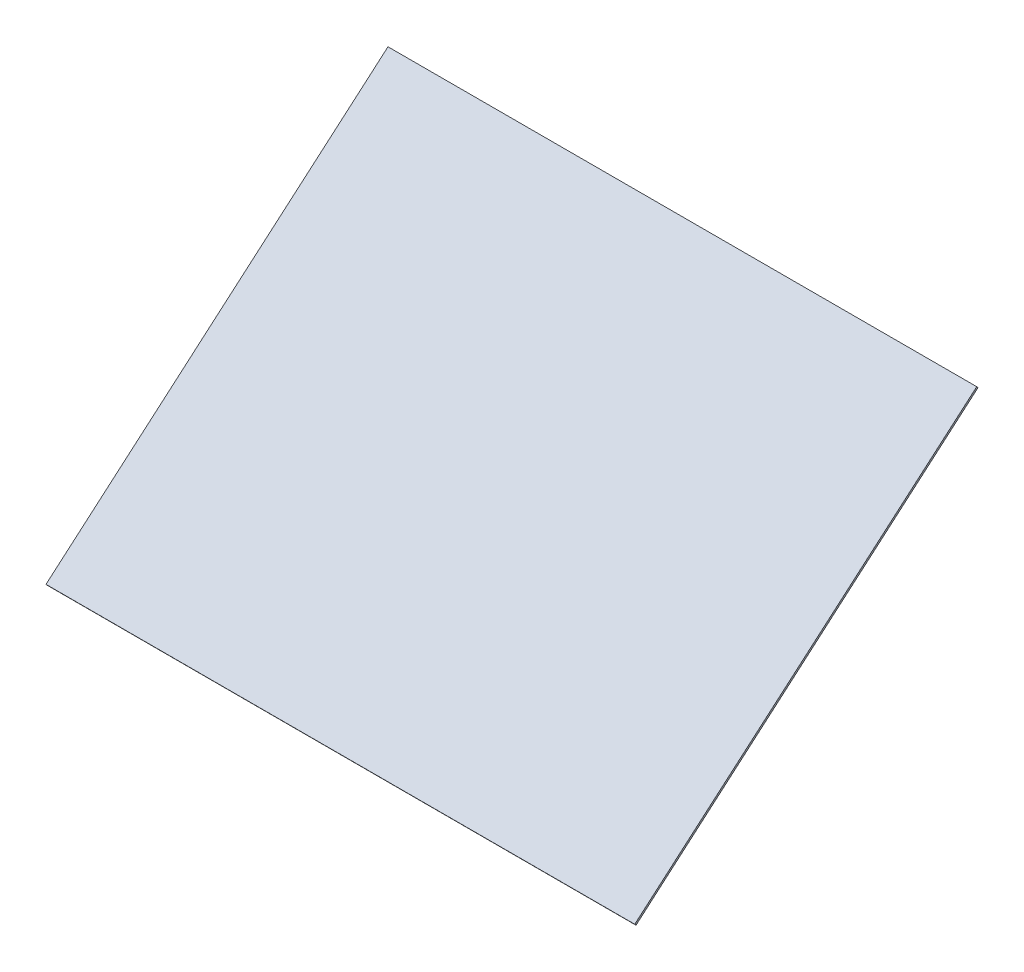
ISO-10303-21;
HEADER;
FILE_DESCRIPTION(('STEP AP214'),'2;1');
FILE_NAME('part.step','',(''),(''),'','','');
FILE_SCHEMA(('AUTOMOTIVE_DESIGN { 1 0 10303 214 1 1 1 1 }'));
ENDSEC;
DATA;
#1=APPLICATION_CONTEXT('core data for automotive mechanical design processes');
#2=APPLICATION_PROTOCOL_DEFINITION('international standard','automotive_design',2000,#1);
#3=PRODUCT_CONTEXT('',#1,'mechanical');
#4=PRODUCT('Part','Part','',(#3));
#5=PRODUCT_RELATED_PRODUCT_CATEGORY('part','',(#4));
#6=PRODUCT_DEFINITION_FORMATION('','',#4);
#7=PRODUCT_DEFINITION_CONTEXT('part definition',#1,'design');
#8=PRODUCT_DEFINITION('design','',#6,#7);
#9=PRODUCT_DEFINITION_SHAPE('','',#8);
#10=(LENGTH_UNIT() NAMED_UNIT(*) SI_UNIT(.MILLI.,.METRE.));
#11=(NAMED_UNIT(*) PLANE_ANGLE_UNIT() SI_UNIT($,.RADIAN.));
#12=(NAMED_UNIT(*) SI_UNIT($,.STERADIAN.) SOLID_ANGLE_UNIT());
#13=UNCERTAINTY_MEASURE_WITH_UNIT(LENGTH_MEASURE(1.E-05),#10,'distance_accuracy_value','');
#14=(GEOMETRIC_REPRESENTATION_CONTEXT(3) GLOBAL_UNCERTAINTY_ASSIGNED_CONTEXT((#13)) GLOBAL_UNIT_ASSIGNED_CONTEXT((#10,
#11,#12)) REPRESENTATION_CONTEXT('',''));
#15=CARTESIAN_POINT('',(0.,0.,0.));
#16=DIRECTION('',(0.,0.,1.));
#17=DIRECTION('',(1.,0.,0.));
#18=AXIS2_PLACEMENT_3D('',#15,#16,#17);
#19=CARTESIAN_POINT('',(0.,31.1330731342222,56.7866863953785));
#20=DIRECTION('',(-1.,0.,0.));
#21=DIRECTION('',(0.,-0.652576928324586,0.757722477308446));
#22=AXIS2_PLACEMENT_3D('',#19,#20,#21);
#23=PLANE('',#22);
#24=DIRECTION('',(0.,0.757722477308446,0.652576928324586));
#25=VECTOR('',#24,1.);
#26=CARTESIAN_POINT('',(0.,31.1330731342222,56.7866863953785));
#27=LINE('',#26,#25);
#28=CARTESIAN_POINT('',(0.,31.0573008864913,56.7214287025461));
#29=VERTEX_POINT('',#28);
#30=CARTESIAN_POINT('',(0.,31.1330731342222,56.7866863953785));
#31=VERTEX_POINT('',#30);
#32=EDGE_CURVE('E11',#29,#31,#27,.T.);
#33=ORIENTED_EDGE('',*,*,#32,.F.);
#34=DIRECTION('',(0.,-0.652576928324586,0.757722477308446));
#35=VECTOR('',#34,1.);
#36=CARTESIAN_POINT('',(0.,31.0573008864913,56.7214287025461));
#37=LINE('',#36,#35);
#38=CARTESIAN_POINT('',(0.,16.0480315350258,74.1490456806403));
#39=VERTEX_POINT('',#38);
#40=EDGE_CURVE('E88',#29,#39,#37,.T.);
#41=ORIENTED_EDGE('',*,*,#40,.T.);
#42=DIRECTION('',(0.,0.757722477308446,0.652576928324586));
#43=VECTOR('',#42,1.);
#44=CARTESIAN_POINT('',(0.,16.1238037827567,74.2143033734728));
#45=LINE('',#44,#43);
#46=CARTESIAN_POINT('',(0.,16.1238037827567,74.2143033734728));
#47=VERTEX_POINT('',#46);
#48=EDGE_CURVE('E43',#39,#47,#45,.T.);
#49=ORIENTED_EDGE('',*,*,#48,.T.);
#50=DIRECTION('',(0.,-0.652576928324586,0.757722477308446));
#51=VECTOR('',#50,1.);
#52=CARTESIAN_POINT('',(0.,31.1330731342222,56.7866863953785));
#53=LINE('',#52,#51);
#54=EDGE_CURVE('E101',#31,#47,#53,.T.);
#55=ORIENTED_EDGE('',*,*,#54,.F.);
#56=EDGE_LOOP('',(#33,#41,#49,#55));
#57=FACE_BOUND('',#56,.T.);
#58=ADVANCED_FACE('F33',(#57),#23,.T.);
#59=CARTESIAN_POINT('',(0.,16.1238037827567,74.2143033734728));
#60=DIRECTION('',(0.,-0.652576928324586,0.757722477308446));
#61=DIRECTION('',(1.,0.,0.));
#62=AXIS2_PLACEMENT_3D('',#59,#60,#61);
#63=PLANE('',#62);
#64=ORIENTED_EDGE('',*,*,#48,.F.);
#65=DIRECTION('',(1.,0.,0.));
#66=VECTOR('',#65,1.);
#67=CARTESIAN_POINT('',(0.,16.0480315350258,74.1490456806403));
#68=LINE('',#67,#66);
#69=CARTESIAN_POINT('',(30.,16.0480315350258,74.1490456806403));
#70=VERTEX_POINT('',#69);
#71=EDGE_CURVE('E95',#39,#70,#68,.T.);
#72=ORIENTED_EDGE('',*,*,#71,.T.);
#73=DIRECTION('',(0.,0.757722477308446,0.652576928324586));
#74=VECTOR('',#73,1.);
#75=CARTESIAN_POINT('',(30.,16.1238037827567,74.2143033734728));
#76=LINE('',#75,#74);
#77=CARTESIAN_POINT('',(30.,16.1238037827567,74.2143033734728));
#78=VERTEX_POINT('',#77);
#79=EDGE_CURVE('E51',#70,#78,#76,.T.);
#80=ORIENTED_EDGE('',*,*,#79,.T.);
#81=DIRECTION('',(1.,0.,0.));
#82=VECTOR('',#81,1.);
#83=CARTESIAN_POINT('',(0.,16.1238037827567,74.2143033734728));
#84=LINE('',#83,#82);
#85=EDGE_CURVE('E82',#47,#78,#84,.T.);
#86=ORIENTED_EDGE('',*,*,#85,.F.);
#87=EDGE_LOOP('',(#64,#72,#80,#86));
#88=FACE_BOUND('',#87,.T.);
#89=ADVANCED_FACE('F105',(#88),#63,.T.);
#90=CARTESIAN_POINT('',(30.,31.1330731342222,56.7866863953785));
#91=DIRECTION('',(-1.,0.,0.));
#92=DIRECTION('',(0.,-0.652576928324586,0.757722477308446));
#93=AXIS2_PLACEMENT_3D('',#90,#91,#92);
#94=PLANE('',#93);
#95=ORIENTED_EDGE('',*,*,#79,.F.);
#96=DIRECTION('',(0.,-0.652576928324586,0.757722477308446));
#97=VECTOR('',#96,1.);
#98=CARTESIAN_POINT('',(30.,31.0573008864913,56.7214287025461));
#99=LINE('',#98,#97);
#100=CARTESIAN_POINT('',(30.,31.0573008864913,56.7214287025461));
#101=VERTEX_POINT('',#100);
#102=EDGE_CURVE('E87',#101,#70,#99,.T.);
#103=ORIENTED_EDGE('',*,*,#102,.F.);
#104=DIRECTION('',(0.,0.757722477308446,0.652576928324586));
#105=VECTOR('',#104,1.);
#106=CARTESIAN_POINT('',(30.,31.1330731342222,56.7866863953785));
#107=LINE('',#106,#105);
#108=CARTESIAN_POINT('',(30.,31.1330731342222,56.7866863953785));
#109=VERTEX_POINT('',#108);
#110=EDGE_CURVE('E37',#101,#109,#107,.T.);
#111=ORIENTED_EDGE('',*,*,#110,.T.);
#112=DIRECTION('',(0.,-0.652576928324586,0.757722477308446));
#113=VECTOR('',#112,1.);
#114=CARTESIAN_POINT('',(30.,31.1330731342222,56.7866863953785));
#115=LINE('',#114,#113);
#116=EDGE_CURVE('E97',#109,#78,#115,.T.);
#117=ORIENTED_EDGE('',*,*,#116,.T.);
#118=EDGE_LOOP('',(#95,#103,#111,#117));
#119=FACE_BOUND('',#118,.T.);
#120=ADVANCED_FACE('F90',(#119),#94,.F.);
#121=CARTESIAN_POINT('',(0.,31.1330731342222,56.7866863953785));
#122=DIRECTION('',(0.,-0.652576928324586,0.757722477308446));
#123=DIRECTION('',(1.,0.,0.));
#124=AXIS2_PLACEMENT_3D('',#121,#122,#123);
#125=PLANE('',#124);
#126=DIRECTION('',(1.,0.,0.));
#127=VECTOR('',#126,1.);
#128=CARTESIAN_POINT('',(0.,31.0573008864913,56.7214287025461));
#129=LINE('',#128,#127);
#130=EDGE_CURVE('E76',#29,#101,#129,.T.);
#131=ORIENTED_EDGE('',*,*,#130,.F.);
#132=ORIENTED_EDGE('',*,*,#32,.T.);
#133=DIRECTION('',(1.,0.,0.));
#134=VECTOR('',#133,1.);
#135=CARTESIAN_POINT('',(0.,31.1330731342222,56.7866863953785));
#136=LINE('',#135,#134);
#137=EDGE_CURVE('E78',#31,#109,#136,.T.);
#138=ORIENTED_EDGE('',*,*,#137,.T.);
#139=ORIENTED_EDGE('',*,*,#110,.F.);
#140=EDGE_LOOP('',(#131,#132,#138,#139));
#141=FACE_BOUND('',#140,.T.);
#142=ADVANCED_FACE('F35',(#141),#125,.F.);
#143=CARTESIAN_POINT('',(0.,31.1330731342222,56.7866863953785));
#144=DIRECTION('',(0.,0.757722477308446,0.652576928324586));
#145=DIRECTION('',(0.,-0.652576928324586,0.757722477308446));
#146=AXIS2_PLACEMENT_3D('',#143,#144,#145);
#147=PLANE('',#146);
#148=ORIENTED_EDGE('',*,*,#116,.F.);
#149=ORIENTED_EDGE('',*,*,#137,.F.);
#150=ORIENTED_EDGE('',*,*,#54,.T.);
#151=ORIENTED_EDGE('',*,*,#85,.T.);
#152=EDGE_LOOP('',(#148,#149,#150,#151));
#153=FACE_BOUND('',#152,.T.);
#154=ADVANCED_FACE('F104',(#153),#147,.T.);
#155=CARTESIAN_POINT('',(0.,31.0573008864913,56.7214287025461));
#156=DIRECTION('',(0.,0.757722477308446,0.652576928324586));
#157=DIRECTION('',(0.,-0.652576928324586,0.757722477308446));
#158=AXIS2_PLACEMENT_3D('',#155,#156,#157);
#159=PLANE('',#158);
#160=ORIENTED_EDGE('',*,*,#102,.T.);
#161=ORIENTED_EDGE('',*,*,#71,.F.);
#162=ORIENTED_EDGE('',*,*,#40,.F.);
#163=ORIENTED_EDGE('',*,*,#130,.T.);
#164=EDGE_LOOP('',(#160,#161,#162,#163));
#165=FACE_BOUND('',#164,.T.);
#166=ADVANCED_FACE('F85',(#165),#159,.F.);
#167=CLOSED_SHELL('',(#58,#89,#120,#142,#154,#166));
#168=MANIFOLD_SOLID_BREP('B2',#167);
#169=ADVANCED_BREP_SHAPE_REPRESENTATION('',(#18,#168),#14);
#170=SHAPE_DEFINITION_REPRESENTATION(#9,#169);
ENDSEC;
END-ISO-10303-21;
